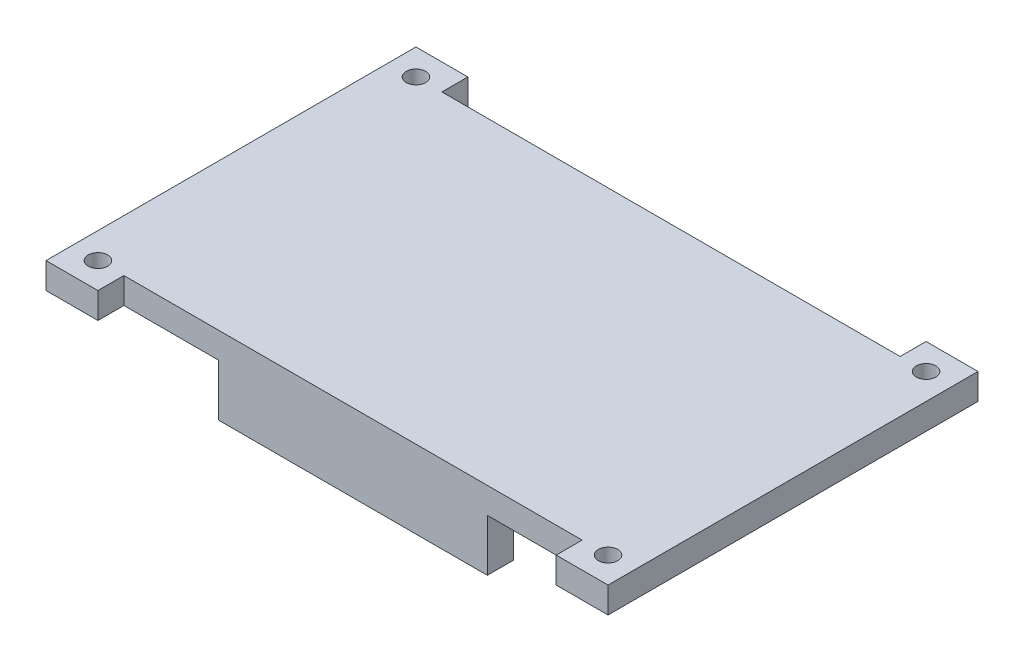
ISO-10303-21;
HEADER;
FILE_DESCRIPTION(('STEP AP214'),'2;1');
FILE_NAME('part.step','',(''),(''),'','','');
FILE_SCHEMA(('AUTOMOTIVE_DESIGN { 1 0 10303 214 1 1 1 1 }'));
ENDSEC;
DATA;
#1=APPLICATION_CONTEXT('core data for automotive mechanical design processes');
#2=APPLICATION_PROTOCOL_DEFINITION('international standard','automotive_design',2000,#1);
#3=PRODUCT_CONTEXT('',#1,'mechanical');
#4=PRODUCT('Part','Part','',(#3));
#5=PRODUCT_RELATED_PRODUCT_CATEGORY('part','',(#4));
#6=PRODUCT_DEFINITION_FORMATION('','',#4);
#7=PRODUCT_DEFINITION_CONTEXT('part definition',#1,'design');
#8=PRODUCT_DEFINITION('design','',#6,#7);
#9=PRODUCT_DEFINITION_SHAPE('','',#8);
#10=(LENGTH_UNIT() NAMED_UNIT(*) SI_UNIT(.MILLI.,.METRE.));
#11=(NAMED_UNIT(*) PLANE_ANGLE_UNIT() SI_UNIT($,.RADIAN.));
#12=(NAMED_UNIT(*) SI_UNIT($,.STERADIAN.) SOLID_ANGLE_UNIT());
#13=UNCERTAINTY_MEASURE_WITH_UNIT(LENGTH_MEASURE(1.E-05),#10,'distance_accuracy_value','');
#14=(GEOMETRIC_REPRESENTATION_CONTEXT(3) GLOBAL_UNCERTAINTY_ASSIGNED_CONTEXT((#13)) GLOBAL_UNIT_ASSIGNED_CONTEXT((#10,
#11,#12)) REPRESENTATION_CONTEXT('',''));
#15=CARTESIAN_POINT('',(0.,0.,0.));
#16=DIRECTION('',(0.,0.,1.));
#17=DIRECTION('',(1.,0.,0.));
#18=AXIS2_PLACEMENT_3D('',#15,#16,#17);
#19=CARTESIAN_POINT('',(0.,-22.3684712166732,0.));
#20=DIRECTION('',(0.,1.,0.));
#21=DIRECTION('',(0.,0.,1.));
#22=AXIS2_PLACEMENT_3D('',#19,#20,#21);
#23=PLANE('',#22);
#24=CARTESIAN_POINT('',(-7.32538359732043,-22.3684712166732,-63.7566410177951));
#25=DIRECTION('',(0.,1.,0.));
#26=DIRECTION('',(0.,0.,1.));
#27=AXIS2_PLACEMENT_3D('',#24,#25,#26);
#28=CIRCLE('',#27,0.750000000000001);
#29=CARTESIAN_POINT('',(-7.32538359732043,-22.3684712166732,-63.0066410177951));
#30=VERTEX_POINT('',#29);
#31=EDGE_CURVE('E342',#30,#30,#28,.F.);
#32=ORIENTED_EDGE('',*,*,#31,.F.);
#33=EDGE_LOOP('',(#32));
#34=FACE_BOUND('',#33,.T.);
#35=CARTESIAN_POINT('',(-7.32538359732043,-22.3684712166732,-39.2566410177951));
#36=DIRECTION('',(0.,1.,0.));
#37=DIRECTION('',(0.,0.,1.));
#38=AXIS2_PLACEMENT_3D('',#35,#36,#37);
#39=CIRCLE('',#38,0.75);
#40=CARTESIAN_POINT('',(-7.32538359732043,-22.3684712166732,-38.5066410177951));
#41=VERTEX_POINT('',#40);
#42=EDGE_CURVE('E346',#41,#41,#39,.F.);
#43=ORIENTED_EDGE('',*,*,#42,.F.);
#44=EDGE_LOOP('',(#43));
#45=FACE_BOUND('',#44,.T.);
#46=CARTESIAN_POINT('',(31.9746164026796,-22.3684712166732,-39.2566410177951));
#47=DIRECTION('',(0.,1.,0.));
#48=DIRECTION('',(0.,0.,1.));
#49=AXIS2_PLACEMENT_3D('',#46,#47,#48);
#50=CIRCLE('',#49,0.749999999999999);
#51=CARTESIAN_POINT('',(31.9746164026796,-22.3684712166732,-38.5066410177951));
#52=VERTEX_POINT('',#51);
#53=EDGE_CURVE('E350',#52,#52,#50,.T.);
#54=ORIENTED_EDGE('',*,*,#53,.T.);
#55=EDGE_LOOP('',(#54));
#56=FACE_BOUND('',#55,.T.);
#57=CARTESIAN_POINT('',(31.9746164026796,-22.3684712166732,-63.7566410177951));
#58=DIRECTION('',(0.,1.,0.));
#59=DIRECTION('',(0.,0.,1.));
#60=AXIS2_PLACEMENT_3D('',#57,#58,#59);
#61=CIRCLE('',#60,0.749999999999985);
#62=CARTESIAN_POINT('',(31.9746164026796,-22.3684712166732,-63.0066410177951));
#63=VERTEX_POINT('',#62);
#64=EDGE_CURVE('E253',#63,#63,#61,.T.);
#65=ORIENTED_EDGE('',*,*,#64,.T.);
#66=EDGE_LOOP('',(#65));
#67=FACE_BOUND('',#66,.T.);
#68=DIRECTION('',(0.,0.,1.));
#69=VECTOR('',#68,1.);
#70=CARTESIAN_POINT('',(27.6746164026796,-22.3684712166732,-63.7566410177951));
#71=LINE('',#70,#69);
#72=CARTESIAN_POINT('',(27.6746164026796,-22.3684712166732,-63.7566410177951));
#73=VERTEX_POINT('',#72);
#74=CARTESIAN_POINT('',(27.6746164026796,-22.3684712166732,-61.7566410177951));
#75=VERTEX_POINT('',#74);
#76=EDGE_CURVE('E201',#73,#75,#71,.T.);
#77=ORIENTED_EDGE('',*,*,#76,.F.);
#78=DIRECTION('',(-1.,0.,0.));
#79=VECTOR('',#78,1.);
#80=CARTESIAN_POINT('',(0.,-22.3684712166732,-63.7566410177951));
#81=LINE('',#80,#79);
#82=CARTESIAN_POINT('',(29.9746164026796,-22.3684712166732,-63.7566410177951));
#83=VERTEX_POINT('',#82);
#84=EDGE_CURVE('E323',#83,#73,#81,.T.);
#85=ORIENTED_EDGE('',*,*,#84,.F.);
#86=DIRECTION('',(0.,0.,1.));
#87=VECTOR('',#86,1.);
#88=CARTESIAN_POINT('',(29.9746164026796,-22.3684712166732,0.));
#89=LINE('',#88,#87);
#90=CARTESIAN_POINT('',(29.9746164026796,-22.3684712166732,-65.7566410177951));
#91=VERTEX_POINT('',#90);
#92=EDGE_CURVE('E319',#91,#83,#89,.T.);
#93=ORIENTED_EDGE('',*,*,#92,.F.);
#94=DIRECTION('',(-1.,0.,0.));
#95=VECTOR('',#94,1.);
#96=CARTESIAN_POINT('',(0.,-22.3684712166732,-65.7566410177951));
#97=LINE('',#96,#95);
#98=CARTESIAN_POINT('',(33.9746164026796,-22.3684712166732,-65.7566410177951));
#99=VERTEX_POINT('',#98);
#100=EDGE_CURVE('E316',#99,#91,#97,.T.);
#101=ORIENTED_EDGE('',*,*,#100,.F.);
#102=DIRECTION('',(0.,0.,-1.));
#103=VECTOR('',#102,1.);
#104=CARTESIAN_POINT('',(33.9746164026796,-22.3684712166732,0.));
#105=LINE('',#104,#103);
#106=CARTESIAN_POINT('',(33.9746164026796,-22.3684712166732,-37.2566410177951));
#107=VERTEX_POINT('',#106);
#108=EDGE_CURVE('E313',#107,#99,#105,.T.);
#109=ORIENTED_EDGE('',*,*,#108,.F.);
#110=DIRECTION('',(1.,0.,0.));
#111=VECTOR('',#110,1.);
#112=CARTESIAN_POINT('',(0.,-22.3684712166732,-37.2566410177951));
#113=LINE('',#112,#111);
#114=CARTESIAN_POINT('',(29.9746164026796,-22.3684712166732,-37.2566410177951));
#115=VERTEX_POINT('',#114);
#116=EDGE_CURVE('E310',#115,#107,#113,.T.);
#117=ORIENTED_EDGE('',*,*,#116,.F.);
#118=DIRECTION('',(0.,0.,1.));
#119=VECTOR('',#118,1.);
#120=CARTESIAN_POINT('',(29.9746164026796,-22.3684712166732,0.));
#121=LINE('',#120,#119);
#122=CARTESIAN_POINT('',(29.9746164026796,-22.3684712166732,-39.2566410177951));
#123=VERTEX_POINT('',#122);
#124=EDGE_CURVE('E307',#123,#115,#121,.T.);
#125=ORIENTED_EDGE('',*,*,#124,.F.);
#126=DIRECTION('',(1.,0.,0.));
#127=VECTOR('',#126,1.);
#128=CARTESIAN_POINT('',(0.,-22.3684712166732,-39.2566410177951));
#129=LINE('',#128,#127);
#130=CARTESIAN_POINT('',(22.6746164026796,-22.3684712166732,-39.2566410177951));
#131=VERTEX_POINT('',#130);
#132=EDGE_CURVE('E247',#131,#123,#129,.T.);
#133=ORIENTED_EDGE('',*,*,#132,.F.);
#134=DIRECTION('',(0.,0.,1.));
#135=VECTOR('',#134,1.);
#136=CARTESIAN_POINT('',(22.6746164026796,-22.3684712166732,-39.2566410177951));
#137=LINE('',#136,#135);
#138=CARTESIAN_POINT('',(22.6746164026796,-22.3684712166732,-41.2566410177951));
#139=VERTEX_POINT('',#138);
#140=EDGE_CURVE('E218',#139,#131,#137,.T.);
#141=ORIENTED_EDGE('',*,*,#140,.F.);
#142=DIRECTION('',(1.,0.,0.));
#143=VECTOR('',#142,1.);
#144=CARTESIAN_POINT('',(1.97461640267956,-22.3684712166732,-41.2566410177951));
#145=LINE('',#144,#143);
#146=CARTESIAN_POINT('',(1.97461640267956,-22.3684712166732,-41.2566410177951));
#147=VERTEX_POINT('',#146);
#148=EDGE_CURVE('E63',#147,#139,#145,.T.);
#149=ORIENTED_EDGE('',*,*,#148,.F.);
#150=DIRECTION('',(0.,0.,-1.));
#151=VECTOR('',#150,1.);
#152=CARTESIAN_POINT('',(1.97461640267956,-22.3684712166732,-39.2566410177951));
#153=LINE('',#152,#151);
#154=CARTESIAN_POINT('',(1.97461640267956,-22.3684712166732,-39.2566410177951));
#155=VERTEX_POINT('',#154);
#156=EDGE_CURVE('E204',#155,#147,#153,.T.);
#157=ORIENTED_EDGE('',*,*,#156,.F.);
#158=CARTESIAN_POINT('',(-5.32538359732044,-22.3684712166732,-39.2566410177951));
#159=VERTEX_POINT('',#158);
#160=EDGE_CURVE('E303',#159,#155,#129,.T.);
#161=ORIENTED_EDGE('',*,*,#160,.F.);
#162=DIRECTION('',(0.,0.,-1.));
#163=VECTOR('',#162,1.);
#164=CARTESIAN_POINT('',(-5.32538359732043,-22.3684712166732,0.));
#165=LINE('',#164,#163);
#166=CARTESIAN_POINT('',(-5.32538359732043,-22.3684712166732,-37.2566410177951));
#167=VERTEX_POINT('',#166);
#168=EDGE_CURVE('E339',#167,#159,#165,.T.);
#169=ORIENTED_EDGE('',*,*,#168,.F.);
#170=DIRECTION('',(1.,0.,0.));
#171=VECTOR('',#170,1.);
#172=CARTESIAN_POINT('',(0.,-22.3684712166732,-37.2566410177951));
#173=LINE('',#172,#171);
#174=CARTESIAN_POINT('',(-9.32538359732044,-22.3684712166732,-37.2566410177951));
#175=VERTEX_POINT('',#174);
#176=EDGE_CURVE('E336',#175,#167,#173,.T.);
#177=ORIENTED_EDGE('',*,*,#176,.F.);
#178=DIRECTION('',(0.,0.,1.));
#179=VECTOR('',#178,1.);
#180=CARTESIAN_POINT('',(-9.32538359732044,-22.3684712166732,0.));
#181=LINE('',#180,#179);
#182=CARTESIAN_POINT('',(-9.32538359732044,-22.3684712166732,-65.7566410177951));
#183=VERTEX_POINT('',#182);
#184=EDGE_CURVE('E333',#183,#175,#181,.T.);
#185=ORIENTED_EDGE('',*,*,#184,.F.);
#186=DIRECTION('',(-1.,0.,0.));
#187=VECTOR('',#186,1.);
#188=CARTESIAN_POINT('',(0.,-22.3684712166732,-65.7566410177951));
#189=LINE('',#188,#187);
#190=CARTESIAN_POINT('',(-5.32538359732044,-22.3684712166732,-65.7566410177951));
#191=VERTEX_POINT('',#190);
#192=EDGE_CURVE('E330',#191,#183,#189,.T.);
#193=ORIENTED_EDGE('',*,*,#192,.F.);
#194=DIRECTION('',(0.,0.,-1.));
#195=VECTOR('',#194,1.);
#196=CARTESIAN_POINT('',(-5.32538359732044,-22.3684712166732,0.));
#197=LINE('',#196,#195);
#198=CARTESIAN_POINT('',(-5.32538359732044,-22.3684712166732,-63.7566410177951));
#199=VERTEX_POINT('',#198);
#200=EDGE_CURVE('E327',#199,#191,#197,.T.);
#201=ORIENTED_EDGE('',*,*,#200,.F.);
#202=CARTESIAN_POINT('',(1.97461640267957,-22.3684712166732,-63.7566410177951));
#203=VERTEX_POINT('',#202);
#204=EDGE_CURVE('E322',#203,#199,#81,.T.);
#205=ORIENTED_EDGE('',*,*,#204,.F.);
#206=DIRECTION('',(0.,0.,-1.));
#207=VECTOR('',#206,1.);
#208=CARTESIAN_POINT('',(1.97461640267957,-22.3684712166732,-63.7566410177951));
#209=LINE('',#208,#207);
#210=CARTESIAN_POINT('',(1.97461640267957,-22.3684712166732,-61.7566410177951));
#211=VERTEX_POINT('',#210);
#212=EDGE_CURVE('E197',#211,#203,#209,.T.);
#213=ORIENTED_EDGE('',*,*,#212,.F.);
#214=DIRECTION('',(-1.,0.,0.));
#215=VECTOR('',#214,1.);
#216=CARTESIAN_POINT('',(27.6746164026796,-22.3684712166732,-61.7566410177951));
#217=LINE('',#216,#215);
#218=EDGE_CURVE('E454',#75,#211,#217,.T.);
#219=ORIENTED_EDGE('',*,*,#218,.F.);
#220=EDGE_LOOP('',(#77,#85,#93,#101,#109,#117,#125,#133,#141,#149,#157,#161,#169,#177,#185,#193,
#201,#205,#213,#219));
#221=FACE_BOUND('',#220,.T.);
#222=ADVANCED_FACE('F39',(#34,#45,#56,#67,#221),#23,.F.);
#223=CARTESIAN_POINT('',(0.,-20.3684712166732,-39.2566410177951));
#224=DIRECTION('',(0.,0.,-1.));
#225=DIRECTION('',(-1.,0.,0.));
#226=AXIS2_PLACEMENT_3D('',#223,#224,#225);
#227=PLANE('',#226);
#228=ORIENTED_EDGE('',*,*,#160,.T.);
#229=DIRECTION('',(0.,1.,0.));
#230=VECTOR('',#229,1.);
#231=CARTESIAN_POINT('',(1.97461640267956,-26.3684712166732,-39.2566410177951));
#232=LINE('',#231,#230);
#233=CARTESIAN_POINT('',(1.97461640267956,-26.3684712166732,-39.2566410177951));
#234=VERTEX_POINT('',#233);
#235=EDGE_CURVE('E226',#234,#155,#232,.T.);
#236=ORIENTED_EDGE('',*,*,#235,.F.);
#237=DIRECTION('',(-1.,0.,0.));
#238=VECTOR('',#237,1.);
#239=CARTESIAN_POINT('',(1.97461640267956,-26.3684712166732,-39.2566410177951));
#240=LINE('',#239,#238);
#241=CARTESIAN_POINT('',(22.6746164026796,-26.3684712166732,-39.2566410177951));
#242=VERTEX_POINT('',#241);
#243=EDGE_CURVE('E224',#242,#234,#240,.T.);
#244=ORIENTED_EDGE('',*,*,#243,.F.);
#245=DIRECTION('',(0.,1.,0.));
#246=VECTOR('',#245,1.);
#247=CARTESIAN_POINT('',(22.6746164026796,-26.3684712166732,-39.2566410177951));
#248=LINE('',#247,#246);
#249=EDGE_CURVE('E236',#242,#131,#248,.T.);
#250=ORIENTED_EDGE('',*,*,#249,.T.);
#251=ORIENTED_EDGE('',*,*,#132,.T.);
#252=DIRECTION('',(0.,-1.,0.));
#253=VECTOR('',#252,1.);
#254=CARTESIAN_POINT('',(29.9746164026796,-20.3684712166732,-39.2566410177951));
#255=LINE('',#254,#253);
#256=CARTESIAN_POINT('',(29.9746164026796,-20.3684712166732,-39.2566410177951));
#257=VERTEX_POINT('',#256);
#258=EDGE_CURVE('E11',#257,#123,#255,.T.);
#259=ORIENTED_EDGE('',*,*,#258,.F.);
#260=DIRECTION('',(1.,0.,0.));
#261=VECTOR('',#260,1.);
#262=CARTESIAN_POINT('',(0.,-20.3684712166732,-39.2566410177951));
#263=LINE('',#262,#261);
#264=CARTESIAN_POINT('',(-5.32538359732044,-20.3684712166732,-39.2566410177951));
#265=VERTEX_POINT('',#264);
#266=EDGE_CURVE('E248',#265,#257,#263,.T.);
#267=ORIENTED_EDGE('',*,*,#266,.F.);
#268=DIRECTION('',(0.,-1.,0.));
#269=VECTOR('',#268,1.);
#270=CARTESIAN_POINT('',(-5.32538359732044,-20.3684712166732,-39.2566410177951));
#271=LINE('',#270,#269);
#272=EDGE_CURVE('E302',#265,#159,#271,.T.);
#273=ORIENTED_EDGE('',*,*,#272,.T.);
#274=EDGE_LOOP('',(#228,#236,#244,#250,#251,#259,#267,#273));
#275=FACE_BOUND('',#274,.T.);
#276=ADVANCED_FACE('F41',(#275),#227,.F.);
#277=CARTESIAN_POINT('',(29.9746164026796,-20.3684712166732,0.));
#278=DIRECTION('',(1.,0.,0.));
#279=DIRECTION('',(0.,0.,-1.));
#280=AXIS2_PLACEMENT_3D('',#277,#278,#279);
#281=PLANE('',#280);
#282=ORIENTED_EDGE('',*,*,#124,.T.);
#283=DIRECTION('',(0.,-1.,0.));
#284=VECTOR('',#283,1.);
#285=CARTESIAN_POINT('',(29.9746164026796,-20.3684712166732,-37.2566410177951));
#286=LINE('',#285,#284);
#287=CARTESIAN_POINT('',(29.9746164026796,-20.3684712166732,-37.2566410177951));
#288=VERTEX_POINT('',#287);
#289=EDGE_CURVE('E48',#288,#115,#286,.T.);
#290=ORIENTED_EDGE('',*,*,#289,.F.);
#291=DIRECTION('',(0.,0.,1.));
#292=VECTOR('',#291,1.);
#293=CARTESIAN_POINT('',(29.9746164026796,-20.3684712166732,0.));
#294=LINE('',#293,#292);
#295=EDGE_CURVE('E252',#257,#288,#294,.T.);
#296=ORIENTED_EDGE('',*,*,#295,.F.);
#297=ORIENTED_EDGE('',*,*,#258,.T.);
#298=EDGE_LOOP('',(#282,#290,#296,#297));
#299=FACE_BOUND('',#298,.T.);
#300=ADVANCED_FACE('F423',(#299),#281,.F.);
#301=CARTESIAN_POINT('',(0.,-20.3684712166732,-37.2566410177951));
#302=DIRECTION('',(0.,0.,-1.));
#303=DIRECTION('',(-1.,0.,0.));
#304=AXIS2_PLACEMENT_3D('',#301,#302,#303);
#305=PLANE('',#304);
#306=ORIENTED_EDGE('',*,*,#116,.T.);
#307=DIRECTION('',(0.,-1.,0.));
#308=VECTOR('',#307,1.);
#309=CARTESIAN_POINT('',(33.9746164026796,-20.3684712166732,-37.2566410177951));
#310=LINE('',#309,#308);
#311=CARTESIAN_POINT('',(33.9746164026796,-20.3684712166732,-37.2566410177951));
#312=VERTEX_POINT('',#311);
#313=EDGE_CURVE('E392',#312,#107,#310,.T.);
#314=ORIENTED_EDGE('',*,*,#313,.F.);
#315=DIRECTION('',(1.,0.,0.));
#316=VECTOR('',#315,1.);
#317=CARTESIAN_POINT('',(0.,-20.3684712166732,-37.2566410177951));
#318=LINE('',#317,#316);
#319=EDGE_CURVE('E256',#288,#312,#318,.T.);
#320=ORIENTED_EDGE('',*,*,#319,.F.);
#321=ORIENTED_EDGE('',*,*,#289,.T.);
#322=EDGE_LOOP('',(#306,#314,#320,#321));
#323=FACE_BOUND('',#322,.T.);
#324=ADVANCED_FACE('F401',(#323),#305,.F.);
#325=CARTESIAN_POINT('',(33.9746164026796,-20.3684712166732,0.));
#326=DIRECTION('',(-1.,0.,0.));
#327=DIRECTION('',(0.,0.,1.));
#328=AXIS2_PLACEMENT_3D('',#325,#326,#327);
#329=PLANE('',#328);
#330=ORIENTED_EDGE('',*,*,#108,.T.);
#331=DIRECTION('',(0.,-1.,0.));
#332=VECTOR('',#331,1.);
#333=CARTESIAN_POINT('',(33.9746164026796,-20.3684712166732,-65.7566410177951));
#334=LINE('',#333,#332);
#335=CARTESIAN_POINT('',(33.9746164026796,-20.3684712166732,-65.7566410177951));
#336=VERTEX_POINT('',#335);
#337=EDGE_CURVE('E388',#336,#99,#334,.T.);
#338=ORIENTED_EDGE('',*,*,#337,.F.);
#339=DIRECTION('',(0.,0.,-1.));
#340=VECTOR('',#339,1.);
#341=CARTESIAN_POINT('',(33.9746164026796,-20.3684712166732,0.));
#342=LINE('',#341,#340);
#343=EDGE_CURVE('E259',#312,#336,#342,.T.);
#344=ORIENTED_EDGE('',*,*,#343,.F.);
#345=ORIENTED_EDGE('',*,*,#313,.T.);
#346=EDGE_LOOP('',(#330,#338,#344,#345));
#347=FACE_BOUND('',#346,.T.);
#348=ADVANCED_FACE('F410',(#347),#329,.F.);
#349=CARTESIAN_POINT('',(0.,-20.3684712166732,-65.7566410177951));
#350=DIRECTION('',(0.,0.,1.));
#351=DIRECTION('',(1.,0.,0.));
#352=AXIS2_PLACEMENT_3D('',#349,#350,#351);
#353=PLANE('',#352);
#354=ORIENTED_EDGE('',*,*,#100,.T.);
#355=DIRECTION('',(0.,-1.,0.));
#356=VECTOR('',#355,1.);
#357=CARTESIAN_POINT('',(29.9746164026796,-20.3684712166732,-65.7566410177951));
#358=LINE('',#357,#356);
#359=CARTESIAN_POINT('',(29.9746164026796,-20.3684712166732,-65.7566410177951));
#360=VERTEX_POINT('',#359);
#361=EDGE_CURVE('E384',#360,#91,#358,.T.);
#362=ORIENTED_EDGE('',*,*,#361,.F.);
#363=DIRECTION('',(-1.,0.,0.));
#364=VECTOR('',#363,1.);
#365=CARTESIAN_POINT('',(0.,-20.3684712166732,-65.7566410177951));
#366=LINE('',#365,#364);
#367=EDGE_CURVE('E262',#336,#360,#366,.T.);
#368=ORIENTED_EDGE('',*,*,#367,.F.);
#369=ORIENTED_EDGE('',*,*,#337,.T.);
#370=EDGE_LOOP('',(#354,#362,#368,#369));
#371=FACE_BOUND('',#370,.T.);
#372=ADVANCED_FACE('F414',(#371),#353,.F.);
#373=CARTESIAN_POINT('',(29.9746164026796,-20.3684712166732,0.));
#374=DIRECTION('',(1.,0.,0.));
#375=DIRECTION('',(0.,0.,-1.));
#376=AXIS2_PLACEMENT_3D('',#373,#374,#375);
#377=PLANE('',#376);
#378=ORIENTED_EDGE('',*,*,#92,.T.);
#379=DIRECTION('',(0.,-1.,0.));
#380=VECTOR('',#379,1.);
#381=CARTESIAN_POINT('',(29.9746164026796,-20.3684712166732,-63.7566410177951));
#382=LINE('',#381,#380);
#383=CARTESIAN_POINT('',(29.9746164026796,-20.3684712166732,-63.7566410177951));
#384=VERTEX_POINT('',#383);
#385=EDGE_CURVE('E380',#384,#83,#382,.T.);
#386=ORIENTED_EDGE('',*,*,#385,.F.);
#387=DIRECTION('',(0.,0.,1.));
#388=VECTOR('',#387,1.);
#389=CARTESIAN_POINT('',(29.9746164026796,-20.3684712166732,0.));
#390=LINE('',#389,#388);
#391=EDGE_CURVE('E265',#360,#384,#390,.T.);
#392=ORIENTED_EDGE('',*,*,#391,.F.);
#393=ORIENTED_EDGE('',*,*,#361,.T.);
#394=EDGE_LOOP('',(#378,#386,#392,#393));
#395=FACE_BOUND('',#394,.T.);
#396=ADVANCED_FACE('F524',(#395),#377,.F.);
#397=CARTESIAN_POINT('',(0.,-20.3684712166732,-63.7566410177951));
#398=DIRECTION('',(0.,0.,1.));
#399=DIRECTION('',(1.,0.,0.));
#400=AXIS2_PLACEMENT_3D('',#397,#398,#399);
#401=PLANE('',#400);
#402=ORIENTED_EDGE('',*,*,#84,.T.);
#403=DIRECTION('',(0.,1.,0.));
#404=VECTOR('',#403,1.);
#405=CARTESIAN_POINT('',(27.6746164026796,-26.3684712166732,-63.7566410177951));
#406=LINE('',#405,#404);
#407=CARTESIAN_POINT('',(27.6746164026796,-26.3684712166732,-63.7566410177951));
#408=VERTEX_POINT('',#407);
#409=EDGE_CURVE('E464',#408,#73,#406,.T.);
#410=ORIENTED_EDGE('',*,*,#409,.F.);
#411=DIRECTION('',(1.,0.,0.));
#412=VECTOR('',#411,1.);
#413=CARTESIAN_POINT('',(27.6746164026796,-26.3684712166732,-63.7566410177951));
#414=LINE('',#413,#412);
#415=CARTESIAN_POINT('',(1.97461640267957,-26.3684712166732,-63.7566410177951));
#416=VERTEX_POINT('',#415);
#417=EDGE_CURVE('E193',#416,#408,#414,.T.);
#418=ORIENTED_EDGE('',*,*,#417,.F.);
#419=DIRECTION('',(0.,1.,0.));
#420=VECTOR('',#419,1.);
#421=CARTESIAN_POINT('',(1.97461640267957,-26.3684712166732,-63.7566410177951));
#422=LINE('',#421,#420);
#423=EDGE_CURVE('E55',#416,#203,#422,.T.);
#424=ORIENTED_EDGE('',*,*,#423,.T.);
#425=ORIENTED_EDGE('',*,*,#204,.T.);
#426=DIRECTION('',(0.,-1.,0.));
#427=VECTOR('',#426,1.);
#428=CARTESIAN_POINT('',(-5.32538359732044,-20.3684712166732,-63.7566410177951));
#429=LINE('',#428,#427);
#430=CARTESIAN_POINT('',(-5.32538359732044,-20.3684712166732,-63.7566410177951));
#431=VERTEX_POINT('',#430);
#432=EDGE_CURVE('E376',#431,#199,#429,.T.);
#433=ORIENTED_EDGE('',*,*,#432,.F.);
#434=DIRECTION('',(-1.,0.,0.));
#435=VECTOR('',#434,1.);
#436=CARTESIAN_POINT('',(0.,-20.3684712166732,-63.7566410177951));
#437=LINE('',#436,#435);
#438=EDGE_CURVE('E268',#384,#431,#437,.T.);
#439=ORIENTED_EDGE('',*,*,#438,.F.);
#440=ORIENTED_EDGE('',*,*,#385,.T.);
#441=EDGE_LOOP('',(#402,#410,#418,#424,#425,#433,#439,#440));
#442=FACE_BOUND('',#441,.T.);
#443=ADVANCED_FACE('F431',(#442),#401,.F.);
#444=CARTESIAN_POINT('',(-5.32538359732044,-20.3684712166732,0.));
#445=DIRECTION('',(-1.,0.,0.));
#446=DIRECTION('',(0.,0.,1.));
#447=AXIS2_PLACEMENT_3D('',#444,#445,#446);
#448=PLANE('',#447);
#449=ORIENTED_EDGE('',*,*,#200,.T.);
#450=DIRECTION('',(0.,-1.,0.));
#451=VECTOR('',#450,1.);
#452=CARTESIAN_POINT('',(-5.32538359732044,-20.3684712166732,-65.7566410177951));
#453=LINE('',#452,#451);
#454=CARTESIAN_POINT('',(-5.32538359732044,-20.3684712166732,-65.7566410177951));
#455=VERTEX_POINT('',#454);
#456=EDGE_CURVE('E372',#455,#191,#453,.T.);
#457=ORIENTED_EDGE('',*,*,#456,.F.);
#458=DIRECTION('',(0.,0.,-1.));
#459=VECTOR('',#458,1.);
#460=CARTESIAN_POINT('',(-5.32538359732044,-20.3684712166732,0.));
#461=LINE('',#460,#459);
#462=EDGE_CURVE('E271',#431,#455,#461,.T.);
#463=ORIENTED_EDGE('',*,*,#462,.F.);
#464=ORIENTED_EDGE('',*,*,#432,.T.);
#465=EDGE_LOOP('',(#449,#457,#463,#464));
#466=FACE_BOUND('',#465,.T.);
#467=ADVANCED_FACE('F437',(#466),#448,.F.);
#468=CARTESIAN_POINT('',(0.,-20.3684712166732,-65.7566410177951));
#469=DIRECTION('',(0.,0.,1.));
#470=DIRECTION('',(1.,0.,0.));
#471=AXIS2_PLACEMENT_3D('',#468,#469,#470);
#472=PLANE('',#471);
#473=ORIENTED_EDGE('',*,*,#192,.T.);
#474=DIRECTION('',(0.,-1.,0.));
#475=VECTOR('',#474,1.);
#476=CARTESIAN_POINT('',(-9.32538359732044,-20.3684712166732,-65.7566410177951));
#477=LINE('',#476,#475);
#478=CARTESIAN_POINT('',(-9.32538359732044,-20.3684712166732,-65.7566410177951));
#479=VERTEX_POINT('',#478);
#480=EDGE_CURVE('E368',#479,#183,#477,.T.);
#481=ORIENTED_EDGE('',*,*,#480,.F.);
#482=DIRECTION('',(-1.,0.,0.));
#483=VECTOR('',#482,1.);
#484=CARTESIAN_POINT('',(0.,-20.3684712166732,-65.7566410177951));
#485=LINE('',#484,#483);
#486=EDGE_CURVE('E274',#455,#479,#485,.T.);
#487=ORIENTED_EDGE('',*,*,#486,.F.);
#488=ORIENTED_EDGE('',*,*,#456,.T.);
#489=EDGE_LOOP('',(#473,#481,#487,#488));
#490=FACE_BOUND('',#489,.T.);
#491=ADVANCED_FACE('F444',(#490),#472,.F.);
#492=CARTESIAN_POINT('',(-9.32538359732044,-20.3684712166732,0.));
#493=DIRECTION('',(1.,0.,0.));
#494=DIRECTION('',(0.,0.,-1.));
#495=AXIS2_PLACEMENT_3D('',#492,#493,#494);
#496=PLANE('',#495);
#497=ORIENTED_EDGE('',*,*,#184,.T.);
#498=DIRECTION('',(0.,-1.,0.));
#499=VECTOR('',#498,1.);
#500=CARTESIAN_POINT('',(-9.32538359732044,-20.3684712166732,-37.2566410177951));
#501=LINE('',#500,#499);
#502=CARTESIAN_POINT('',(-9.32538359732044,-20.3684712166732,-37.2566410177951));
#503=VERTEX_POINT('',#502);
#504=EDGE_CURVE('E364',#503,#175,#501,.T.);
#505=ORIENTED_EDGE('',*,*,#504,.F.);
#506=DIRECTION('',(0.,0.,1.));
#507=VECTOR('',#506,1.);
#508=CARTESIAN_POINT('',(-9.32538359732044,-20.3684712166732,0.));
#509=LINE('',#508,#507);
#510=EDGE_CURVE('E277',#479,#503,#509,.T.);
#511=ORIENTED_EDGE('',*,*,#510,.F.);
#512=ORIENTED_EDGE('',*,*,#480,.T.);
#513=EDGE_LOOP('',(#497,#505,#511,#512));
#514=FACE_BOUND('',#513,.T.);
#515=ADVANCED_FACE('F448',(#514),#496,.F.);
#516=CARTESIAN_POINT('',(0.,-20.3684712166732,-37.2566410177951));
#517=DIRECTION('',(0.,0.,-1.));
#518=DIRECTION('',(-1.,0.,0.));
#519=AXIS2_PLACEMENT_3D('',#516,#517,#518);
#520=PLANE('',#519);
#521=ORIENTED_EDGE('',*,*,#176,.T.);
#522=DIRECTION('',(0.,-1.,0.));
#523=VECTOR('',#522,1.);
#524=CARTESIAN_POINT('',(-5.32538359732043,-20.3684712166732,-37.2566410177951));
#525=LINE('',#524,#523);
#526=CARTESIAN_POINT('',(-5.32538359732043,-20.3684712166732,-37.2566410177951));
#527=VERTEX_POINT('',#526);
#528=EDGE_CURVE('E360',#527,#167,#525,.T.);
#529=ORIENTED_EDGE('',*,*,#528,.F.);
#530=DIRECTION('',(1.,0.,0.));
#531=VECTOR('',#530,1.);
#532=CARTESIAN_POINT('',(0.,-20.3684712166732,-37.2566410177951));
#533=LINE('',#532,#531);
#534=EDGE_CURVE('E280',#503,#527,#533,.T.);
#535=ORIENTED_EDGE('',*,*,#534,.F.);
#536=ORIENTED_EDGE('',*,*,#504,.T.);
#537=EDGE_LOOP('',(#521,#529,#535,#536));
#538=FACE_BOUND('',#537,.T.);
#539=ADVANCED_FACE('F501',(#538),#520,.F.);
#540=CARTESIAN_POINT('',(31.9746164026796,-20.3684712166732,-39.2566410177951));
#541=DIRECTION('',(0.,-1.,0.));
#542=DIRECTION('',(0.,0.,-1.));
#543=AXIS2_PLACEMENT_3D('',#540,#541,#542);
#544=CYLINDRICAL_SURFACE('',#543,0.749999999999999);
#545=CARTESIAN_POINT('',(31.9746164026796,-20.3684712166732,-39.2566410177951));
#546=DIRECTION('',(0.,1.,0.));
#547=DIRECTION('',(0.,0.,1.));
#548=AXIS2_PLACEMENT_3D('',#545,#546,#547);
#549=CIRCLE('',#548,0.749999999999999);
#550=CARTESIAN_POINT('',(31.9746164026796,-20.3684712166732,-38.5066410177951));
#551=VERTEX_POINT('',#550);
#552=EDGE_CURVE('E294',#551,#551,#549,.T.);
#553=ORIENTED_EDGE('',*,*,#552,.T.);
#554=EDGE_LOOP('',(#553));
#555=FACE_BOUND('',#554,.T.);
#556=ORIENTED_EDGE('',*,*,#53,.F.);
#557=EDGE_LOOP('',(#556));
#558=FACE_BOUND('',#557,.T.);
#559=ADVANCED_FACE('F497',(#555,#558),#544,.F.);
#560=CARTESIAN_POINT('',(-7.32538359732043,-20.3684712166732,-39.2566410177951));
#561=DIRECTION('',(0.,-1.,0.));
#562=DIRECTION('',(0.,0.,-1.));
#563=AXIS2_PLACEMENT_3D('',#560,#561,#562);
#564=CYLINDRICAL_SURFACE('',#563,0.75);
#565=CARTESIAN_POINT('',(-7.32538359732043,-20.3684712166732,-39.2566410177951));
#566=DIRECTION('',(0.,1.,0.));
#567=DIRECTION('',(0.,0.,1.));
#568=AXIS2_PLACEMENT_3D('',#565,#566,#567);
#569=CIRCLE('',#568,0.75);
#570=CARTESIAN_POINT('',(-7.32538359732043,-20.3684712166732,-38.5066410177951));
#571=VERTEX_POINT('',#570);
#572=EDGE_CURVE('E290',#571,#571,#569,.F.);
#573=ORIENTED_EDGE('',*,*,#572,.F.);
#574=EDGE_LOOP('',(#573));
#575=FACE_BOUND('',#574,.T.);
#576=ORIENTED_EDGE('',*,*,#42,.T.);
#577=EDGE_LOOP('',(#576));
#578=FACE_BOUND('',#577,.T.);
#579=ADVANCED_FACE('F500',(#575,#578),#564,.F.);
#580=CARTESIAN_POINT('',(-7.32538359732043,-20.3684712166732,-63.7566410177951));
#581=DIRECTION('',(0.,-1.,0.));
#582=DIRECTION('',(0.,0.,-1.));
#583=AXIS2_PLACEMENT_3D('',#580,#581,#582);
#584=CYLINDRICAL_SURFACE('',#583,0.750000000000001);
#585=CARTESIAN_POINT('',(-7.32538359732043,-20.3684712166732,-63.7566410177951));
#586=DIRECTION('',(0.,1.,0.));
#587=DIRECTION('',(0.,0.,1.));
#588=AXIS2_PLACEMENT_3D('',#585,#586,#587);
#589=CIRCLE('',#588,0.750000000000001);
#590=CARTESIAN_POINT('',(-7.32538359732043,-20.3684712166732,-63.0066410177951));
#591=VERTEX_POINT('',#590);
#592=EDGE_CURVE('E286',#591,#591,#589,.F.);
#593=ORIENTED_EDGE('',*,*,#592,.F.);
#594=EDGE_LOOP('',(#593));
#595=FACE_BOUND('',#594,.T.);
#596=ORIENTED_EDGE('',*,*,#31,.T.);
#597=EDGE_LOOP('',(#596));
#598=FACE_BOUND('',#597,.T.);
#599=ADVANCED_FACE('F505',(#595,#598),#584,.F.);
#600=CARTESIAN_POINT('',(-5.32538359732043,-20.3684712166732,0.));
#601=DIRECTION('',(-1.,0.,0.));
#602=DIRECTION('',(0.,0.,1.));
#603=AXIS2_PLACEMENT_3D('',#600,#601,#602);
#604=PLANE('',#603);
#605=ORIENTED_EDGE('',*,*,#168,.T.);
#606=ORIENTED_EDGE('',*,*,#272,.F.);
#607=DIRECTION('',(0.,0.,-1.));
#608=VECTOR('',#607,1.);
#609=CARTESIAN_POINT('',(-5.32538359732043,-20.3684712166732,0.));
#610=LINE('',#609,#608);
#611=EDGE_CURVE('E283',#527,#265,#610,.T.);
#612=ORIENTED_EDGE('',*,*,#611,.F.);
#613=ORIENTED_EDGE('',*,*,#528,.T.);
#614=EDGE_LOOP('',(#605,#606,#612,#613));
#615=FACE_BOUND('',#614,.T.);
#616=ADVANCED_FACE('F495',(#615),#604,.F.);
#617=CARTESIAN_POINT('',(31.9746164026796,-20.3684712166732,-63.7566410177951));
#618=DIRECTION('',(0.,-1.,0.));
#619=DIRECTION('',(0.,0.,-1.));
#620=AXIS2_PLACEMENT_3D('',#617,#618,#619);
#621=CYLINDRICAL_SURFACE('',#620,0.749999999999985);
#622=CARTESIAN_POINT('',(31.9746164026796,-20.3684712166732,-63.7566410177951));
#623=DIRECTION('',(0.,1.,0.));
#624=DIRECTION('',(0.,0.,1.));
#625=AXIS2_PLACEMENT_3D('',#622,#623,#624);
#626=CIRCLE('',#625,0.749999999999985);
#627=CARTESIAN_POINT('',(31.9746164026796,-20.3684712166732,-63.0066410177951));
#628=VERTEX_POINT('',#627);
#629=EDGE_CURVE('E298',#628,#628,#626,.T.);
#630=ORIENTED_EDGE('',*,*,#629,.T.);
#631=EDGE_LOOP('',(#630));
#632=FACE_BOUND('',#631,.T.);
#633=ORIENTED_EDGE('',*,*,#64,.F.);
#634=EDGE_LOOP('',(#633));
#635=FACE_BOUND('',#634,.T.);
#636=ADVANCED_FACE('F492',(#632,#635),#621,.F.);
#637=CARTESIAN_POINT('',(0.,-20.3684712166732,0.));
#638=DIRECTION('',(0.,1.,0.));
#639=DIRECTION('',(0.,0.,1.));
#640=AXIS2_PLACEMENT_3D('',#637,#638,#639);
#641=PLANE('',#640);
#642=ORIENTED_EDGE('',*,*,#266,.T.);
#643=ORIENTED_EDGE('',*,*,#295,.T.);
#644=ORIENTED_EDGE('',*,*,#319,.T.);
#645=ORIENTED_EDGE('',*,*,#343,.T.);
#646=ORIENTED_EDGE('',*,*,#367,.T.);
#647=ORIENTED_EDGE('',*,*,#391,.T.);
#648=ORIENTED_EDGE('',*,*,#438,.T.);
#649=ORIENTED_EDGE('',*,*,#462,.T.);
#650=ORIENTED_EDGE('',*,*,#486,.T.);
#651=ORIENTED_EDGE('',*,*,#510,.T.);
#652=ORIENTED_EDGE('',*,*,#534,.T.);
#653=ORIENTED_EDGE('',*,*,#611,.T.);
#654=EDGE_LOOP('',(#642,#643,#644,#645,#646,#647,#648,#649,#650,#651,#652,#653));
#655=FACE_BOUND('',#654,.T.);
#656=ORIENTED_EDGE('',*,*,#592,.T.);
#657=EDGE_LOOP('',(#656));
#658=FACE_BOUND('',#657,.T.);
#659=ORIENTED_EDGE('',*,*,#572,.T.);
#660=EDGE_LOOP('',(#659));
#661=FACE_BOUND('',#660,.T.);
#662=ORIENTED_EDGE('',*,*,#552,.F.);
#663=EDGE_LOOP('',(#662));
#664=FACE_BOUND('',#663,.T.);
#665=ORIENTED_EDGE('',*,*,#629,.F.);
#666=EDGE_LOOP('',(#665));
#667=FACE_BOUND('',#666,.T.);
#668=ADVANCED_FACE('F418',(#655,#658,#661,#664,#667),#641,.T.);
#669=CARTESIAN_POINT('',(1.97461640267956,-26.3684712166732,-39.2566410177951));
#670=DIRECTION('',(1.,0.,0.));
#671=DIRECTION('',(0.,0.,-1.));
#672=AXIS2_PLACEMENT_3D('',#669,#670,#671);
#673=PLANE('',#672);
#674=ORIENTED_EDGE('',*,*,#156,.T.);
#675=DIRECTION('',(0.,1.,0.));
#676=VECTOR('',#675,1.);
#677=CARTESIAN_POINT('',(1.97461640267956,-26.3684712166732,-41.2566410177951));
#678=LINE('',#677,#676);
#679=CARTESIAN_POINT('',(1.97461640267956,-26.3684712166732,-41.2566410177951));
#680=VERTEX_POINT('',#679);
#681=EDGE_CURVE('E244',#680,#147,#678,.T.);
#682=ORIENTED_EDGE('',*,*,#681,.F.);
#683=DIRECTION('',(0.,0.,-1.));
#684=VECTOR('',#683,1.);
#685=CARTESIAN_POINT('',(1.97461640267956,-26.3684712166732,-39.2566410177951));
#686=LINE('',#685,#684);
#687=EDGE_CURVE('E213',#234,#680,#686,.T.);
#688=ORIENTED_EDGE('',*,*,#687,.F.);
#689=ORIENTED_EDGE('',*,*,#235,.T.);
#690=EDGE_LOOP('',(#674,#682,#688,#689));
#691=FACE_BOUND('',#690,.T.);
#692=ADVANCED_FACE('F591',(#691),#673,.F.);
#693=CARTESIAN_POINT('',(1.97461640267956,-26.3684712166732,-41.2566410177951));
#694=DIRECTION('',(0.,0.,1.));
#695=DIRECTION('',(1.,0.,0.));
#696=AXIS2_PLACEMENT_3D('',#693,#694,#695);
#697=PLANE('',#696);
#698=ORIENTED_EDGE('',*,*,#148,.T.);
#699=DIRECTION('',(0.,1.,0.));
#700=VECTOR('',#699,1.);
#701=CARTESIAN_POINT('',(22.6746164026796,-26.3684712166732,-41.2566410177951));
#702=LINE('',#701,#700);
#703=CARTESIAN_POINT('',(22.6746164026796,-26.3684712166732,-41.2566410177951));
#704=VERTEX_POINT('',#703);
#705=EDGE_CURVE('E240',#704,#139,#702,.T.);
#706=ORIENTED_EDGE('',*,*,#705,.F.);
#707=DIRECTION('',(1.,0.,0.));
#708=VECTOR('',#707,1.);
#709=CARTESIAN_POINT('',(1.97461640267956,-26.3684712166732,-41.2566410177951));
#710=LINE('',#709,#708);
#711=EDGE_CURVE('E217',#680,#704,#710,.T.);
#712=ORIENTED_EDGE('',*,*,#711,.F.);
#713=ORIENTED_EDGE('',*,*,#681,.T.);
#714=EDGE_LOOP('',(#698,#706,#712,#713));
#715=FACE_BOUND('',#714,.T.);
#716=ADVANCED_FACE('F610',(#715),#697,.F.);
#717=CARTESIAN_POINT('',(22.6746164026796,-26.3684712166732,-39.2566410177951));
#718=DIRECTION('',(-1.,0.,0.));
#719=DIRECTION('',(0.,0.,1.));
#720=AXIS2_PLACEMENT_3D('',#717,#718,#719);
#721=PLANE('',#720);
#722=ORIENTED_EDGE('',*,*,#140,.T.);
#723=ORIENTED_EDGE('',*,*,#249,.F.);
#724=DIRECTION('',(0.,0.,1.));
#725=VECTOR('',#724,1.);
#726=CARTESIAN_POINT('',(22.6746164026796,-26.3684712166732,-39.2566410177951));
#727=LINE('',#726,#725);
#728=EDGE_CURVE('E221',#704,#242,#727,.T.);
#729=ORIENTED_EDGE('',*,*,#728,.F.);
#730=ORIENTED_EDGE('',*,*,#705,.T.);
#731=EDGE_LOOP('',(#722,#723,#729,#730));
#732=FACE_BOUND('',#731,.T.);
#733=ADVANCED_FACE('F617',(#732),#721,.F.);
#734=CARTESIAN_POINT('',(0.,-26.3684712166732,0.));
#735=DIRECTION('',(0.,-1.,0.));
#736=DIRECTION('',(0.,0.,-1.));
#737=AXIS2_PLACEMENT_3D('',#734,#735,#736);
#738=PLANE('',#737);
#739=ORIENTED_EDGE('',*,*,#687,.T.);
#740=ORIENTED_EDGE('',*,*,#711,.T.);
#741=ORIENTED_EDGE('',*,*,#728,.T.);
#742=ORIENTED_EDGE('',*,*,#243,.T.);
#743=EDGE_LOOP('',(#739,#740,#741,#742));
#744=FACE_BOUND('',#743,.T.);
#745=ADVANCED_FACE('F625',(#744),#738,.T.);
#746=CARTESIAN_POINT('',(27.6746164026796,-26.3684712166732,-63.7566410177951));
#747=DIRECTION('',(-1.,0.,0.));
#748=DIRECTION('',(0.,0.,1.));
#749=AXIS2_PLACEMENT_3D('',#746,#747,#748);
#750=PLANE('',#749);
#751=ORIENTED_EDGE('',*,*,#76,.T.);
#752=DIRECTION('',(0.,1.,0.));
#753=VECTOR('',#752,1.);
#754=CARTESIAN_POINT('',(27.6746164026796,-26.3684712166732,-61.7566410177951));
#755=LINE('',#754,#753);
#756=CARTESIAN_POINT('',(27.6746164026796,-26.3684712166732,-61.7566410177951));
#757=VERTEX_POINT('',#756);
#758=EDGE_CURVE('E181',#757,#75,#755,.T.);
#759=ORIENTED_EDGE('',*,*,#758,.F.);
#760=DIRECTION('',(0.,0.,1.));
#761=VECTOR('',#760,1.);
#762=CARTESIAN_POINT('',(27.6746164026796,-26.3684712166732,-63.7566410177951));
#763=LINE('',#762,#761);
#764=EDGE_CURVE('E189',#408,#757,#763,.T.);
#765=ORIENTED_EDGE('',*,*,#764,.F.);
#766=ORIENTED_EDGE('',*,*,#409,.T.);
#767=EDGE_LOOP('',(#751,#759,#765,#766));
#768=FACE_BOUND('',#767,.T.);
#769=ADVANCED_FACE('F199',(#768),#750,.F.);
#770=CARTESIAN_POINT('',(27.6746164026796,-26.3684712166732,-61.7566410177951));
#771=DIRECTION('',(0.,0.,-1.));
#772=DIRECTION('',(-1.,0.,0.));
#773=AXIS2_PLACEMENT_3D('',#770,#771,#772);
#774=PLANE('',#773);
#775=ORIENTED_EDGE('',*,*,#218,.T.);
#776=DIRECTION('',(0.,1.,0.));
#777=VECTOR('',#776,1.);
#778=CARTESIAN_POINT('',(1.97461640267957,-26.3684712166732,-61.7566410177951));
#779=LINE('',#778,#777);
#780=CARTESIAN_POINT('',(1.97461640267957,-26.3684712166732,-61.7566410177951));
#781=VERTEX_POINT('',#780);
#782=EDGE_CURVE('E184',#781,#211,#779,.T.);
#783=ORIENTED_EDGE('',*,*,#782,.F.);
#784=DIRECTION('',(-1.,0.,0.));
#785=VECTOR('',#784,1.);
#786=CARTESIAN_POINT('',(27.6746164026796,-26.3684712166732,-61.7566410177951));
#787=LINE('',#786,#785);
#788=EDGE_CURVE('E177',#757,#781,#787,.T.);
#789=ORIENTED_EDGE('',*,*,#788,.F.);
#790=ORIENTED_EDGE('',*,*,#758,.T.);
#791=EDGE_LOOP('',(#775,#783,#789,#790));
#792=FACE_BOUND('',#791,.T.);
#793=ADVANCED_FACE('F179',(#792),#774,.F.);
#794=CARTESIAN_POINT('',(1.97461640267957,-26.3684712166732,-63.7566410177951));
#795=DIRECTION('',(1.,0.,0.));
#796=DIRECTION('',(0.,0.,-1.));
#797=AXIS2_PLACEMENT_3D('',#794,#795,#796);
#798=PLANE('',#797);
#799=ORIENTED_EDGE('',*,*,#212,.T.);
#800=ORIENTED_EDGE('',*,*,#423,.F.);
#801=DIRECTION('',(0.,0.,-1.));
#802=VECTOR('',#801,1.);
#803=CARTESIAN_POINT('',(1.97461640267957,-26.3684712166732,-63.7566410177951));
#804=LINE('',#803,#802);
#805=EDGE_CURVE('E188',#781,#416,#804,.T.);
#806=ORIENTED_EDGE('',*,*,#805,.F.);
#807=ORIENTED_EDGE('',*,*,#782,.T.);
#808=EDGE_LOOP('',(#799,#800,#806,#807));
#809=FACE_BOUND('',#808,.T.);
#810=ADVANCED_FACE('F470',(#809),#798,.F.);
#811=CARTESIAN_POINT('',(0.,-26.3684712166732,0.));
#812=DIRECTION('',(0.,-1.,0.));
#813=DIRECTION('',(0.,0.,-1.));
#814=AXIS2_PLACEMENT_3D('',#811,#812,#813);
#815=PLANE('',#814);
#816=ORIENTED_EDGE('',*,*,#764,.T.);
#817=ORIENTED_EDGE('',*,*,#788,.T.);
#818=ORIENTED_EDGE('',*,*,#805,.T.);
#819=ORIENTED_EDGE('',*,*,#417,.T.);
#820=EDGE_LOOP('',(#816,#817,#818,#819));
#821=FACE_BOUND('',#820,.T.);
#822=ADVANCED_FACE('F192',(#821),#815,.T.);
#823=CLOSED_SHELL('',(#222,#276,#300,#324,#348,#372,#396,#443,#467,#491,#515,#539,#559,#579,
#599,#616,#636,#668,#692,#716,#733,#745,#769,#793,#810,#822));
#824=MANIFOLD_SOLID_BREP('B2',#823);
#825=ADVANCED_BREP_SHAPE_REPRESENTATION('',(#18,#824),#14);
#826=SHAPE_DEFINITION_REPRESENTATION(#9,#825);
ENDSEC;
END-ISO-10303-21;
